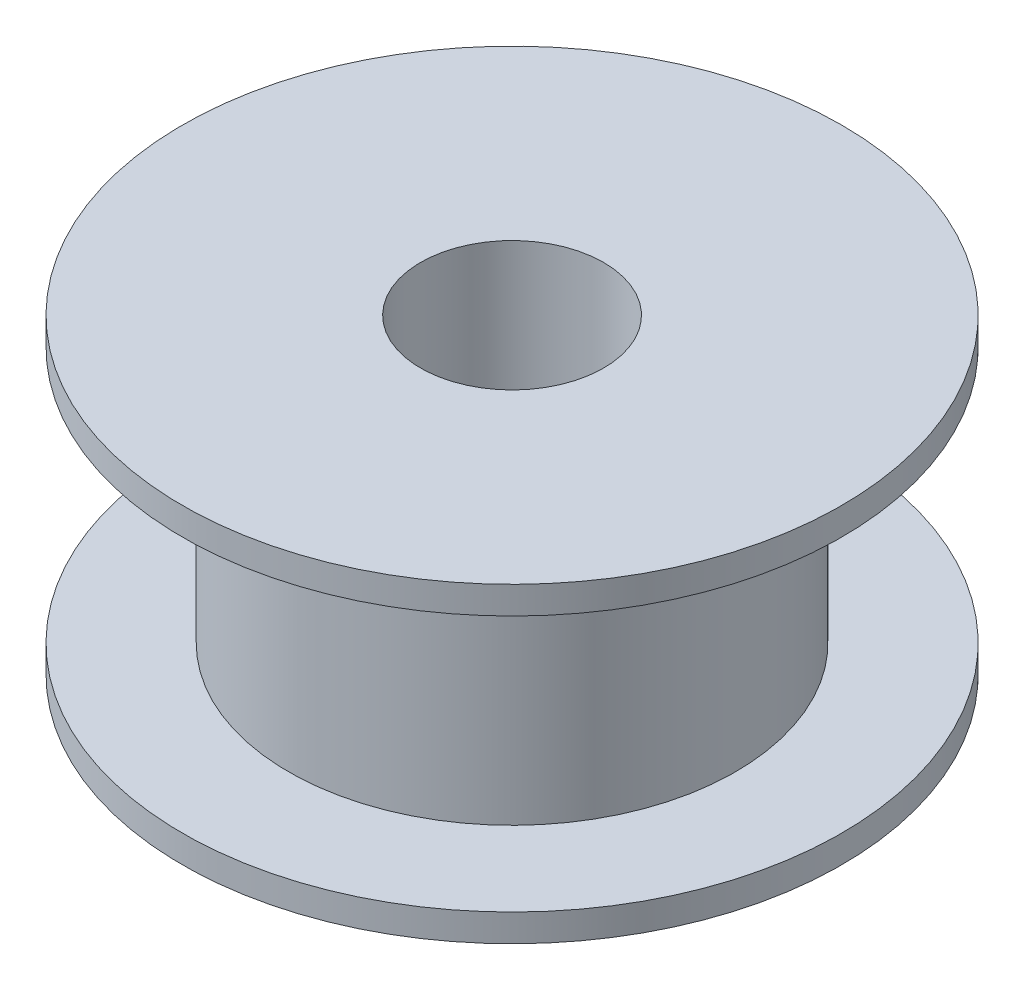
ISO-10303-21;
HEADER;
FILE_DESCRIPTION(('STEP AP214'),'2;1');
FILE_NAME('part.step','',(''),(''),'','','');
FILE_SCHEMA(('AUTOMOTIVE_DESIGN { 1 0 10303 214 1 1 1 1 }'));
ENDSEC;
DATA;
#1=APPLICATION_CONTEXT('core data for automotive mechanical design processes');
#2=APPLICATION_PROTOCOL_DEFINITION('international standard','automotive_design',2000,#1);
#3=PRODUCT_CONTEXT('',#1,'mechanical');
#4=PRODUCT('Part','Part','',(#3));
#5=PRODUCT_RELATED_PRODUCT_CATEGORY('part','',(#4));
#6=PRODUCT_DEFINITION_FORMATION('','',#4);
#7=PRODUCT_DEFINITION_CONTEXT('part definition',#1,'design');
#8=PRODUCT_DEFINITION('design','',#6,#7);
#9=PRODUCT_DEFINITION_SHAPE('','',#8);
#10=(LENGTH_UNIT() NAMED_UNIT(*) SI_UNIT(.MILLI.,.METRE.));
#11=(NAMED_UNIT(*) PLANE_ANGLE_UNIT() SI_UNIT($,.RADIAN.));
#12=(NAMED_UNIT(*) SI_UNIT($,.STERADIAN.) SOLID_ANGLE_UNIT());
#13=UNCERTAINTY_MEASURE_WITH_UNIT(LENGTH_MEASURE(1.E-05),#10,'distance_accuracy_value','');
#14=(GEOMETRIC_REPRESENTATION_CONTEXT(3) GLOBAL_UNCERTAINTY_ASSIGNED_CONTEXT((#13)) GLOBAL_UNIT_ASSIGNED_CONTEXT((#10,
#11,#12)) REPRESENTATION_CONTEXT('',''));
#15=CARTESIAN_POINT('',(0.,0.,0.));
#16=DIRECTION('',(0.,0.,1.));
#17=DIRECTION('',(1.,0.,0.));
#18=AXIS2_PLACEMENT_3D('',#15,#16,#17);
#19=CARTESIAN_POINT('',(9.,0.,0.));
#20=DIRECTION('',(0.,-1.,0.));
#21=DIRECTION('',(0.,0.,-1.));
#22=AXIS2_PLACEMENT_3D('',#19,#20,#21);
#23=PLANE('',#22);
#24=CARTESIAN_POINT('',(0.,0.,0.));
#25=DIRECTION('',(0.,-1.,0.));
#26=DIRECTION('',(0.,0.,-1.));
#27=AXIS2_PLACEMENT_3D('',#24,#25,#26);
#28=CIRCLE('',#27,9.);
#29=CARTESIAN_POINT('',(0.,0.,-9.));
#30=VERTEX_POINT('',#29);
#31=EDGE_CURVE('E63',#30,#30,#28,.T.);
#32=ORIENTED_EDGE('',*,*,#31,.T.);
#33=EDGE_LOOP('',(#32));
#34=FACE_BOUND('',#33,.T.);
#35=CARTESIAN_POINT('',(0.,0.,0.));
#36=DIRECTION('',(0.,-1.,0.));
#37=DIRECTION('',(0.,0.,-1.));
#38=AXIS2_PLACEMENT_3D('',#35,#36,#37);
#39=CIRCLE('',#38,2.5);
#40=CARTESIAN_POINT('',(0.,0.,-2.5));
#41=VERTEX_POINT('',#40);
#42=EDGE_CURVE('E10',#41,#41,#39,.T.);
#43=ORIENTED_EDGE('',*,*,#42,.F.);
#44=EDGE_LOOP('',(#43));
#45=FACE_BOUND('',#44,.T.);
#46=ADVANCED_FACE('F35',(#34,#45),#23,.T.);
#47=CARTESIAN_POINT('',(0.,0.,0.));
#48=DIRECTION('',(0.,-1.,0.));
#49=DIRECTION('',(0.,0.,-1.));
#50=AXIS2_PLACEMENT_3D('',#47,#48,#49);
#51=CYLINDRICAL_SURFACE('',#50,2.5);
#52=ORIENTED_EDGE('',*,*,#42,.T.);
#53=EDGE_LOOP('',(#52));
#54=FACE_BOUND('',#53,.T.);
#55=CARTESIAN_POINT('',(0.,8.5,0.));
#56=DIRECTION('',(0.,-1.,0.));
#57=DIRECTION('',(0.,0.,-1.));
#58=AXIS2_PLACEMENT_3D('',#55,#56,#57);
#59=CIRCLE('',#58,2.5);
#60=CARTESIAN_POINT('',(0.,8.5,-2.5));
#61=VERTEX_POINT('',#60);
#62=EDGE_CURVE('E41',#61,#61,#59,.T.);
#63=ORIENTED_EDGE('',*,*,#62,.F.);
#64=EDGE_LOOP('',(#63));
#65=FACE_BOUND('',#64,.T.);
#66=ADVANCED_FACE('F81',(#54,#65),#51,.F.);
#67=CARTESIAN_POINT('',(2.5,8.5,0.));
#68=DIRECTION('',(0.,1.,0.));
#69=DIRECTION('',(0.,0.,1.));
#70=AXIS2_PLACEMENT_3D('',#67,#68,#69);
#71=PLANE('',#70);
#72=ORIENTED_EDGE('',*,*,#62,.T.);
#73=EDGE_LOOP('',(#72));
#74=FACE_BOUND('',#73,.T.);
#75=CARTESIAN_POINT('',(0.,8.5,0.));
#76=DIRECTION('',(0.,-1.,0.));
#77=DIRECTION('',(0.,0.,-1.));
#78=AXIS2_PLACEMENT_3D('',#75,#76,#77);
#79=CIRCLE('',#78,9.);
#80=CARTESIAN_POINT('',(0.,8.5,-9.));
#81=VERTEX_POINT('',#80);
#82=EDGE_CURVE('E45',#81,#81,#79,.T.);
#83=ORIENTED_EDGE('',*,*,#82,.F.);
#84=EDGE_LOOP('',(#83));
#85=FACE_BOUND('',#84,.T.);
#86=ADVANCED_FACE('F85',(#74,#85),#71,.T.);
#87=CARTESIAN_POINT('',(0.,0.,0.));
#88=DIRECTION('',(0.,-1.,0.));
#89=DIRECTION('',(0.,0.,-1.));
#90=AXIS2_PLACEMENT_3D('',#87,#88,#89);
#91=CYLINDRICAL_SURFACE('',#90,9.);
#92=ORIENTED_EDGE('',*,*,#82,.T.);
#93=EDGE_LOOP('',(#92));
#94=FACE_BOUND('',#93,.T.);
#95=CARTESIAN_POINT('',(0.,7.75,0.));
#96=DIRECTION('',(0.,-1.,0.));
#97=DIRECTION('',(0.,0.,-1.));
#98=AXIS2_PLACEMENT_3D('',#95,#96,#97);
#99=CIRCLE('',#98,9.);
#100=CARTESIAN_POINT('',(0.,7.75,-9.));
#101=VERTEX_POINT('',#100);
#102=EDGE_CURVE('E49',#101,#101,#99,.T.);
#103=ORIENTED_EDGE('',*,*,#102,.F.);
#104=EDGE_LOOP('',(#103));
#105=FACE_BOUND('',#104,.T.);
#106=ADVANCED_FACE('F89',(#94,#105),#91,.T.);
#107=CARTESIAN_POINT('',(9.,7.75,0.));
#108=DIRECTION('',(0.,-1.,0.));
#109=DIRECTION('',(0.,0.,-1.));
#110=AXIS2_PLACEMENT_3D('',#107,#108,#109);
#111=PLANE('',#110);
#112=ORIENTED_EDGE('',*,*,#102,.T.);
#113=EDGE_LOOP('',(#112));
#114=FACE_BOUND('',#113,.T.);
#115=CARTESIAN_POINT('',(0.,7.75,0.));
#116=DIRECTION('',(0.,-1.,0.));
#117=DIRECTION('',(0.,0.,-1.));
#118=AXIS2_PLACEMENT_3D('',#115,#116,#117);
#119=CIRCLE('',#118,6.1);
#120=CARTESIAN_POINT('',(0.,7.75,-6.1));
#121=VERTEX_POINT('',#120);
#122=EDGE_CURVE('E54',#121,#121,#119,.T.);
#123=ORIENTED_EDGE('',*,*,#122,.F.);
#124=EDGE_LOOP('',(#123));
#125=FACE_BOUND('',#124,.T.);
#126=ADVANCED_FACE('F95',(#114,#125),#111,.T.);
#127=CARTESIAN_POINT('',(0.,0.,0.));
#128=DIRECTION('',(0.,-1.,0.));
#129=DIRECTION('',(0.,0.,-1.));
#130=AXIS2_PLACEMENT_3D('',#127,#128,#129);
#131=CYLINDRICAL_SURFACE('',#130,6.1);
#132=ORIENTED_EDGE('',*,*,#122,.T.);
#133=EDGE_LOOP('',(#132));
#134=FACE_BOUND('',#133,.T.);
#135=CARTESIAN_POINT('',(0.,0.75,0.));
#136=DIRECTION('',(0.,-1.,0.));
#137=DIRECTION('',(0.,0.,-1.));
#138=AXIS2_PLACEMENT_3D('',#135,#136,#137);
#139=CIRCLE('',#138,6.1);
#140=CARTESIAN_POINT('',(0.,0.75,-6.1));
#141=VERTEX_POINT('',#140);
#142=EDGE_CURVE('E57',#141,#141,#139,.T.);
#143=ORIENTED_EDGE('',*,*,#142,.F.);
#144=EDGE_LOOP('',(#143));
#145=FACE_BOUND('',#144,.T.);
#146=ADVANCED_FACE('F77',(#134,#145),#131,.T.);
#147=CARTESIAN_POINT('',(6.1,0.75,0.));
#148=DIRECTION('',(0.,1.,0.));
#149=DIRECTION('',(0.,0.,1.));
#150=AXIS2_PLACEMENT_3D('',#147,#148,#149);
#151=PLANE('',#150);
#152=ORIENTED_EDGE('',*,*,#142,.T.);
#153=EDGE_LOOP('',(#152));
#154=FACE_BOUND('',#153,.T.);
#155=CARTESIAN_POINT('',(0.,0.75,0.));
#156=DIRECTION('',(0.,-1.,0.));
#157=DIRECTION('',(0.,0.,-1.));
#158=AXIS2_PLACEMENT_3D('',#155,#156,#157);
#159=CIRCLE('',#158,9.);
#160=CARTESIAN_POINT('',(0.,0.75,-9.));
#161=VERTEX_POINT('',#160);
#162=EDGE_CURVE('E60',#161,#161,#159,.T.);
#163=ORIENTED_EDGE('',*,*,#162,.F.);
#164=EDGE_LOOP('',(#163));
#165=FACE_BOUND('',#164,.T.);
#166=ADVANCED_FACE('F71',(#154,#165),#151,.T.);
#167=CARTESIAN_POINT('',(0.,0.,0.));
#168=DIRECTION('',(0.,-1.,0.));
#169=DIRECTION('',(0.,0.,-1.));
#170=AXIS2_PLACEMENT_3D('',#167,#168,#169);
#171=CYLINDRICAL_SURFACE('',#170,9.);
#172=ORIENTED_EDGE('',*,*,#162,.T.);
#173=EDGE_LOOP('',(#172));
#174=FACE_BOUND('',#173,.T.);
#175=ORIENTED_EDGE('',*,*,#31,.F.);
#176=EDGE_LOOP('',(#175));
#177=FACE_BOUND('',#176,.T.);
#178=ADVANCED_FACE('F69',(#174,#177),#171,.T.);
#179=CLOSED_SHELL('',(#46,#66,#86,#106,#126,#146,#166,#178));
#180=MANIFOLD_SOLID_BREP('B2',#179);
#181=ADVANCED_BREP_SHAPE_REPRESENTATION('',(#18,#180),#14);
#182=SHAPE_DEFINITION_REPRESENTATION(#9,#181);
ENDSEC;
END-ISO-10303-21;
